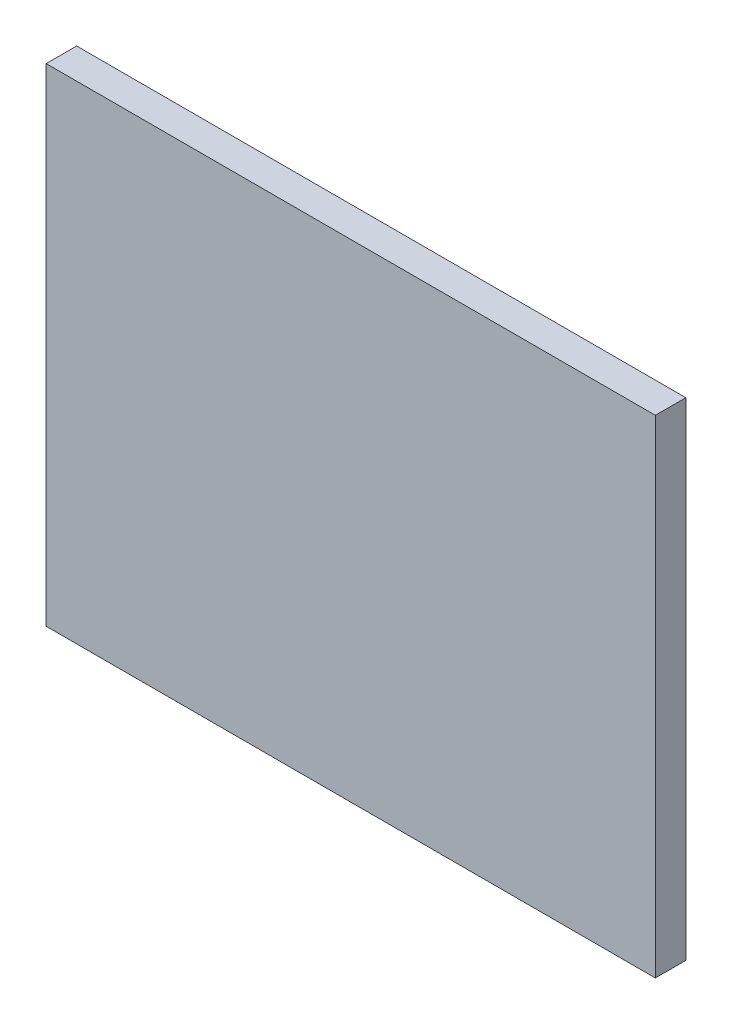
ISO-10303-21;
HEADER;
FILE_DESCRIPTION(('STEP AP214'),'2;1');
FILE_NAME('part.step','',(''),(''),'','','');
FILE_SCHEMA(('AUTOMOTIVE_DESIGN { 1 0 10303 214 1 1 1 1 }'));
ENDSEC;
DATA;
#1=APPLICATION_CONTEXT('core data for automotive mechanical design processes');
#2=APPLICATION_PROTOCOL_DEFINITION('international standard','automotive_design',2000,#1);
#3=PRODUCT_CONTEXT('',#1,'mechanical');
#4=PRODUCT('Part','Part','',(#3));
#5=PRODUCT_RELATED_PRODUCT_CATEGORY('part','',(#4));
#6=PRODUCT_DEFINITION_FORMATION('','',#4);
#7=PRODUCT_DEFINITION_CONTEXT('part definition',#1,'design');
#8=PRODUCT_DEFINITION('design','',#6,#7);
#9=PRODUCT_DEFINITION_SHAPE('','',#8);
#10=(LENGTH_UNIT() NAMED_UNIT(*) SI_UNIT(.MILLI.,.METRE.));
#11=(NAMED_UNIT(*) PLANE_ANGLE_UNIT() SI_UNIT($,.RADIAN.));
#12=(NAMED_UNIT(*) SI_UNIT($,.STERADIAN.) SOLID_ANGLE_UNIT());
#13=UNCERTAINTY_MEASURE_WITH_UNIT(LENGTH_MEASURE(1.E-05),#10,'distance_accuracy_value','');
#14=(GEOMETRIC_REPRESENTATION_CONTEXT(3) GLOBAL_UNCERTAINTY_ASSIGNED_CONTEXT((#13)) GLOBAL_UNIT_ASSIGNED_CONTEXT((#10,
#11,#12)) REPRESENTATION_CONTEXT('',''));
#15=CARTESIAN_POINT('',(0.,0.,0.));
#16=DIRECTION('',(0.,0.,1.));
#17=DIRECTION('',(1.,0.,0.));
#18=AXIS2_PLACEMENT_3D('',#15,#16,#17);
#19=CARTESIAN_POINT('',(-52.7642276422764,32.7642276422764,5.));
#20=DIRECTION('',(1.,0.,0.));
#21=DIRECTION('',(0.,0.,-1.));
#22=AXIS2_PLACEMENT_3D('',#19,#20,#21);
#23=PLANE('',#22);
#24=DIRECTION('',(0.,-1.,0.));
#25=VECTOR('',#24,1.);
#26=CARTESIAN_POINT('',(-52.7642276422764,32.7642276422764,0.));
#27=LINE('',#26,#25);
#28=CARTESIAN_POINT('',(-52.7642276422764,32.7642276422764,0.));
#29=VERTEX_POINT('',#28);
#30=CARTESIAN_POINT('',(-52.7642276422764,-47.2357723577236,0.));
#31=VERTEX_POINT('',#30);
#32=EDGE_CURVE('E100',#29,#31,#27,.T.);
#33=ORIENTED_EDGE('',*,*,#32,.T.);
#34=DIRECTION('',(0.,0.,-1.));
#35=VECTOR('',#34,1.);
#36=CARTESIAN_POINT('',(-52.7642276422764,-47.2357723577236,5.));
#37=LINE('',#36,#35);
#38=CARTESIAN_POINT('',(-52.7642276422764,-47.2357723577236,5.));
#39=VERTEX_POINT('',#38);
#40=EDGE_CURVE('E11',#39,#31,#37,.T.);
#41=ORIENTED_EDGE('',*,*,#40,.F.);
#42=DIRECTION('',(0.,-1.,0.));
#43=VECTOR('',#42,1.);
#44=CARTESIAN_POINT('',(-52.7642276422764,32.7642276422764,5.));
#45=LINE('',#44,#43);
#46=CARTESIAN_POINT('',(-52.7642276422764,32.7642276422764,5.));
#47=VERTEX_POINT('',#46);
#48=EDGE_CURVE('E88',#47,#39,#45,.T.);
#49=ORIENTED_EDGE('',*,*,#48,.F.);
#50=DIRECTION('',(0.,0.,-1.));
#51=VECTOR('',#50,1.);
#52=CARTESIAN_POINT('',(-52.7642276422764,32.7642276422764,5.));
#53=LINE('',#52,#51);
#54=EDGE_CURVE('E96',#47,#29,#53,.T.);
#55=ORIENTED_EDGE('',*,*,#54,.T.);
#56=EDGE_LOOP('',(#33,#41,#49,#55));
#57=FACE_BOUND('',#56,.T.);
#58=ADVANCED_FACE('F37',(#57),#23,.F.);
#59=CARTESIAN_POINT('',(-52.7642276422764,-47.2357723577236,5.));
#60=DIRECTION('',(0.,1.,0.));
#61=DIRECTION('',(0.,0.,1.));
#62=AXIS2_PLACEMENT_3D('',#59,#60,#61);
#63=PLANE('',#62);
#64=DIRECTION('',(1.,0.,0.));
#65=VECTOR('',#64,1.);
#66=CARTESIAN_POINT('',(-52.7642276422764,-47.2357723577236,0.));
#67=LINE('',#66,#65);
#68=CARTESIAN_POINT('',(47.2357723577236,-47.2357723577236,0.));
#69=VERTEX_POINT('',#68);
#70=EDGE_CURVE('E92',#31,#69,#67,.T.);
#71=ORIENTED_EDGE('',*,*,#70,.T.);
#72=DIRECTION('',(0.,0.,-1.));
#73=VECTOR('',#72,1.);
#74=CARTESIAN_POINT('',(47.2357723577236,-47.2357723577236,5.));
#75=LINE('',#74,#73);
#76=CARTESIAN_POINT('',(47.2357723577236,-47.2357723577236,5.));
#77=VERTEX_POINT('',#76);
#78=EDGE_CURVE('E45',#77,#69,#75,.T.);
#79=ORIENTED_EDGE('',*,*,#78,.F.);
#80=DIRECTION('',(1.,0.,0.));
#81=VECTOR('',#80,1.);
#82=CARTESIAN_POINT('',(-52.7642276422764,-47.2357723577236,5.));
#83=LINE('',#82,#81);
#84=EDGE_CURVE('E83',#39,#77,#83,.T.);
#85=ORIENTED_EDGE('',*,*,#84,.F.);
#86=ORIENTED_EDGE('',*,*,#40,.T.);
#87=EDGE_LOOP('',(#71,#79,#85,#86));
#88=FACE_BOUND('',#87,.T.);
#89=ADVANCED_FACE('F91',(#88),#63,.F.);
#90=CARTESIAN_POINT('',(47.2357723577236,32.7642276422764,5.));
#91=DIRECTION('',(-1.,0.,0.));
#92=DIRECTION('',(0.,-1.,0.));
#93=AXIS2_PLACEMENT_3D('',#90,#91,#92);
#94=PLANE('',#93);
#95=DIRECTION('',(0.,1.,0.));
#96=VECTOR('',#95,1.);
#97=CARTESIAN_POINT('',(47.2357723577236,32.7642276422764,0.));
#98=LINE('',#97,#96);
#99=CARTESIAN_POINT('',(47.2357723577236,32.7642276422764,0.));
#100=VERTEX_POINT('',#99);
#101=EDGE_CURVE('E70',#69,#100,#98,.T.);
#102=ORIENTED_EDGE('',*,*,#101,.T.);
#103=DIRECTION('',(0.,0.,-1.));
#104=VECTOR('',#103,1.);
#105=CARTESIAN_POINT('',(47.2357723577236,32.7642276422764,5.));
#106=LINE('',#105,#104);
#107=CARTESIAN_POINT('',(47.2357723577236,32.7642276422764,5.));
#108=VERTEX_POINT('',#107);
#109=EDGE_CURVE('E93',#108,#100,#106,.T.);
#110=ORIENTED_EDGE('',*,*,#109,.F.);
#111=DIRECTION('',(0.,1.,0.));
#112=VECTOR('',#111,1.);
#113=CARTESIAN_POINT('',(47.2357723577236,32.7642276422764,5.));
#114=LINE('',#113,#112);
#115=EDGE_CURVE('E86',#77,#108,#114,.T.);
#116=ORIENTED_EDGE('',*,*,#115,.F.);
#117=ORIENTED_EDGE('',*,*,#78,.T.);
#118=EDGE_LOOP('',(#102,#110,#116,#117));
#119=FACE_BOUND('',#118,.T.);
#120=ADVANCED_FACE('F94',(#119),#94,.F.);
#121=CARTESIAN_POINT('',(-52.7642276422764,32.7642276422764,5.));
#122=DIRECTION('',(0.,-1.,0.));
#123=DIRECTION('',(0.,0.,-1.));
#124=AXIS2_PLACEMENT_3D('',#121,#122,#123);
#125=PLANE('',#124);
#126=DIRECTION('',(-1.,0.,0.));
#127=VECTOR('',#126,1.);
#128=CARTESIAN_POINT('',(-52.7642276422764,32.7642276422764,0.));
#129=LINE('',#128,#127);
#130=EDGE_CURVE('E76',#100,#29,#129,.T.);
#131=ORIENTED_EDGE('',*,*,#130,.T.);
#132=ORIENTED_EDGE('',*,*,#54,.F.);
#133=DIRECTION('',(-1.,0.,0.));
#134=VECTOR('',#133,1.);
#135=CARTESIAN_POINT('',(-52.7642276422764,32.7642276422764,5.));
#136=LINE('',#135,#134);
#137=EDGE_CURVE('E53',#108,#47,#136,.T.);
#138=ORIENTED_EDGE('',*,*,#137,.F.);
#139=ORIENTED_EDGE('',*,*,#109,.T.);
#140=EDGE_LOOP('',(#131,#132,#138,#139));
#141=FACE_BOUND('',#140,.T.);
#142=ADVANCED_FACE('F107',(#141),#125,.F.);
#143=CARTESIAN_POINT('',(0.,0.,5.));
#144=DIRECTION('',(0.,0.,1.));
#145=DIRECTION('',(1.,0.,0.));
#146=AXIS2_PLACEMENT_3D('',#143,#144,#145);
#147=PLANE('',#146);
#148=ORIENTED_EDGE('',*,*,#48,.T.);
#149=ORIENTED_EDGE('',*,*,#84,.T.);
#150=ORIENTED_EDGE('',*,*,#115,.T.);
#151=ORIENTED_EDGE('',*,*,#137,.T.);
#152=EDGE_LOOP('',(#148,#149,#150,#151));
#153=FACE_BOUND('',#152,.T.);
#154=ADVANCED_FACE('F84',(#153),#147,.T.);
#155=CARTESIAN_POINT('',(0.,0.,0.));
#156=DIRECTION('',(0.,0.,1.));
#157=DIRECTION('',(1.,0.,0.));
#158=AXIS2_PLACEMENT_3D('',#155,#156,#157);
#159=PLANE('',#158);
#160=ORIENTED_EDGE('',*,*,#32,.F.);
#161=ORIENTED_EDGE('',*,*,#130,.F.);
#162=ORIENTED_EDGE('',*,*,#101,.F.);
#163=ORIENTED_EDGE('',*,*,#70,.F.);
#164=EDGE_LOOP('',(#160,#161,#162,#163));
#165=FACE_BOUND('',#164,.T.);
#166=ADVANCED_FACE('F110',(#165),#159,.F.);
#167=CLOSED_SHELL('',(#58,#89,#120,#142,#154,#166));
#168=MANIFOLD_SOLID_BREP('B2',#167);
#169=ADVANCED_BREP_SHAPE_REPRESENTATION('',(#18,#168),#14);
#170=SHAPE_DEFINITION_REPRESENTATION(#9,#169);
ENDSEC;
END-ISO-10303-21;
